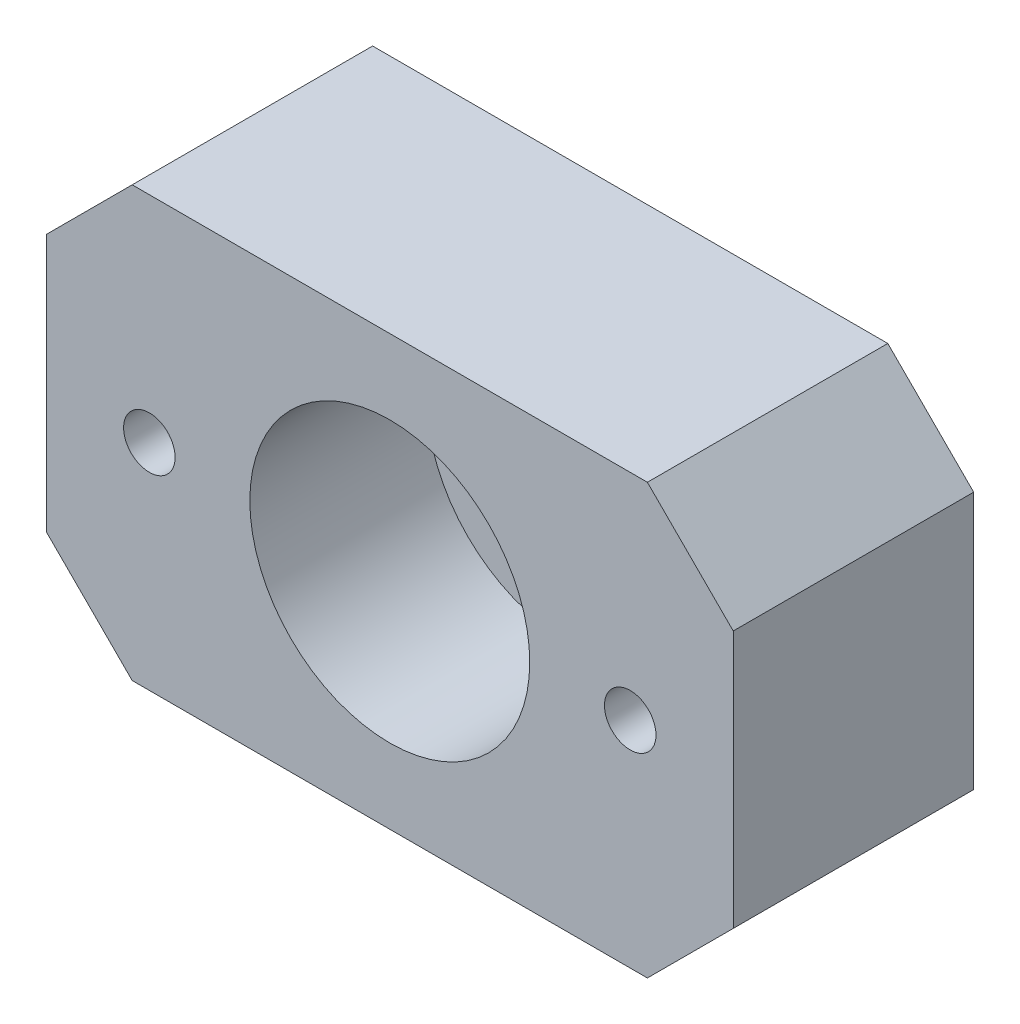
ISO-10303-21;
HEADER;
FILE_DESCRIPTION(('STEP AP214'),'2;1');
FILE_NAME('part.step','',(''),(''),'','','');
FILE_SCHEMA(('AUTOMOTIVE_DESIGN { 1 0 10303 214 1 1 1 1 }'));
ENDSEC;
DATA;
#1=APPLICATION_CONTEXT('core data for automotive mechanical design processes');
#2=APPLICATION_PROTOCOL_DEFINITION('international standard','automotive_design',2000,#1);
#3=PRODUCT_CONTEXT('',#1,'mechanical');
#4=PRODUCT('Part','Part','',(#3));
#5=PRODUCT_RELATED_PRODUCT_CATEGORY('part','',(#4));
#6=PRODUCT_DEFINITION_FORMATION('','',#4);
#7=PRODUCT_DEFINITION_CONTEXT('part definition',#1,'design');
#8=PRODUCT_DEFINITION('design','',#6,#7);
#9=PRODUCT_DEFINITION_SHAPE('','',#8);
#10=(LENGTH_UNIT() NAMED_UNIT(*) SI_UNIT(.MILLI.,.METRE.));
#11=(NAMED_UNIT(*) PLANE_ANGLE_UNIT() SI_UNIT($,.RADIAN.));
#12=(NAMED_UNIT(*) SI_UNIT($,.STERADIAN.) SOLID_ANGLE_UNIT());
#13=UNCERTAINTY_MEASURE_WITH_UNIT(LENGTH_MEASURE(1.E-05),#10,'distance_accuracy_value','');
#14=(GEOMETRIC_REPRESENTATION_CONTEXT(3) GLOBAL_UNCERTAINTY_ASSIGNED_CONTEXT((#13)) GLOBAL_UNIT_ASSIGNED_CONTEXT((#10,
#11,#12)) REPRESENTATION_CONTEXT('',''));
#15=CARTESIAN_POINT('',(0.,0.,0.));
#16=DIRECTION('',(0.,0.,1.));
#17=DIRECTION('',(1.,0.,0.));
#18=AXIS2_PLACEMENT_3D('',#15,#16,#17);
#19=CARTESIAN_POINT('',(0.,0.,14.));
#20=DIRECTION('',(1.,0.,0.));
#21=DIRECTION('',(0.,1.,0.));
#22=AXIS2_PLACEMENT_3D('',#19,#20,#21);
#23=PLANE('',#22);
#24=DIRECTION('',(0.,-1.,0.));
#25=VECTOR('',#24,1.);
#26=CARTESIAN_POINT('',(0.,0.,0.));
#27=LINE('',#26,#25);
#28=CARTESIAN_POINT('',(0.,20.,0.));
#29=VERTEX_POINT('',#28);
#30=CARTESIAN_POINT('',(0.,5.00000000000002,0.));
#31=VERTEX_POINT('',#30);
#32=EDGE_CURVE('E135',#29,#31,#27,.T.);
#33=ORIENTED_EDGE('',*,*,#32,.T.);
#34=DIRECTION('',(0.,0.,1.));
#35=VECTOR('',#34,1.);
#36=CARTESIAN_POINT('',(0.,5.00000000000002,14.));
#37=LINE('',#36,#35);
#38=CARTESIAN_POINT('',(0.,5.00000000000002,14.));
#39=VERTEX_POINT('',#38);
#40=EDGE_CURVE('E158',#31,#39,#37,.T.);
#41=ORIENTED_EDGE('',*,*,#40,.T.);
#42=DIRECTION('',(0.,-1.,0.));
#43=VECTOR('',#42,1.);
#44=CARTESIAN_POINT('',(0.,0.,14.));
#45=LINE('',#44,#43);
#46=CARTESIAN_POINT('',(0.,20.,14.));
#47=VERTEX_POINT('',#46);
#48=EDGE_CURVE('E133',#47,#39,#45,.T.);
#49=ORIENTED_EDGE('',*,*,#48,.F.);
#50=DIRECTION('',(0.,0.,-1.));
#51=VECTOR('',#50,1.);
#52=CARTESIAN_POINT('',(0.,20.,14.));
#53=LINE('',#52,#51);
#54=EDGE_CURVE('E155',#47,#29,#53,.T.);
#55=ORIENTED_EDGE('',*,*,#54,.T.);
#56=EDGE_LOOP('',(#33,#41,#49,#55));
#57=FACE_BOUND('',#56,.T.);
#58=ADVANCED_FACE('F39',(#57),#23,.F.);
#59=CARTESIAN_POINT('',(0.,0.,14.));
#60=DIRECTION('',(0.,1.,0.));
#61=DIRECTION('',(0.,0.,1.));
#62=AXIS2_PLACEMENT_3D('',#59,#60,#61);
#63=PLANE('',#62);
#64=DIRECTION('',(1.,0.,0.));
#65=VECTOR('',#64,1.);
#66=CARTESIAN_POINT('',(0.,0.,0.));
#67=LINE('',#66,#65);
#68=CARTESIAN_POINT('',(5.,0.,0.));
#69=VERTEX_POINT('',#68);
#70=CARTESIAN_POINT('',(35.,0.,0.));
#71=VERTEX_POINT('',#70);
#72=EDGE_CURVE('E131',#69,#71,#67,.T.);
#73=ORIENTED_EDGE('',*,*,#72,.T.);
#74=DIRECTION('',(0.,0.,1.));
#75=VECTOR('',#74,1.);
#76=CARTESIAN_POINT('',(35.,0.,14.));
#77=LINE('',#76,#75);
#78=CARTESIAN_POINT('',(35.,0.,14.));
#79=VERTEX_POINT('',#78);
#80=EDGE_CURVE('E110',#71,#79,#77,.T.);
#81=ORIENTED_EDGE('',*,*,#80,.T.);
#82=DIRECTION('',(1.,0.,0.));
#83=VECTOR('',#82,1.);
#84=CARTESIAN_POINT('',(0.,0.,14.));
#85=LINE('',#84,#83);
#86=CARTESIAN_POINT('',(5.,0.,14.));
#87=VERTEX_POINT('',#86);
#88=EDGE_CURVE('E174',#87,#79,#85,.T.);
#89=ORIENTED_EDGE('',*,*,#88,.F.);
#90=DIRECTION('',(0.,0.,-1.));
#91=VECTOR('',#90,1.);
#92=CARTESIAN_POINT('',(5.,0.,14.));
#93=LINE('',#92,#91);
#94=EDGE_CURVE('E115',#87,#69,#93,.T.);
#95=ORIENTED_EDGE('',*,*,#94,.T.);
#96=EDGE_LOOP('',(#73,#81,#89,#95));
#97=FACE_BOUND('',#96,.T.);
#98=ADVANCED_FACE('F220',(#97),#63,.F.);
#99=CARTESIAN_POINT('',(40.,0.,14.));
#100=DIRECTION('',(-1.,0.,0.));
#101=DIRECTION('',(0.,-1.,0.));
#102=AXIS2_PLACEMENT_3D('',#99,#100,#101);
#103=PLANE('',#102);
#104=DIRECTION('',(0.,1.,0.));
#105=VECTOR('',#104,1.);
#106=CARTESIAN_POINT('',(40.,0.,14.));
#107=LINE('',#106,#105);
#108=CARTESIAN_POINT('',(40.,4.99999999999999,14.));
#109=VERTEX_POINT('',#108);
#110=CARTESIAN_POINT('',(40.,20.,14.));
#111=VERTEX_POINT('',#110);
#112=EDGE_CURVE('E124',#109,#111,#107,.T.);
#113=ORIENTED_EDGE('',*,*,#112,.F.);
#114=DIRECTION('',(0.,0.,-1.));
#115=VECTOR('',#114,1.);
#116=CARTESIAN_POINT('',(40.,4.99999999999999,14.));
#117=LINE('',#116,#115);
#118=CARTESIAN_POINT('',(40.,4.99999999999999,0.));
#119=VERTEX_POINT('',#118);
#120=EDGE_CURVE('E109',#109,#119,#117,.T.);
#121=ORIENTED_EDGE('',*,*,#120,.T.);
#122=DIRECTION('',(0.,1.,0.));
#123=VECTOR('',#122,1.);
#124=CARTESIAN_POINT('',(40.,0.,0.));
#125=LINE('',#124,#123);
#126=CARTESIAN_POINT('',(40.,20.,0.));
#127=VERTEX_POINT('',#126);
#128=EDGE_CURVE('E122',#119,#127,#125,.T.);
#129=ORIENTED_EDGE('',*,*,#128,.T.);
#130=DIRECTION('',(0.,0.,1.));
#131=VECTOR('',#130,1.);
#132=CARTESIAN_POINT('',(40.,20.,14.));
#133=LINE('',#132,#131);
#134=EDGE_CURVE('E126',#127,#111,#133,.T.);
#135=ORIENTED_EDGE('',*,*,#134,.T.);
#136=EDGE_LOOP('',(#113,#121,#129,#135));
#137=FACE_BOUND('',#136,.T.);
#138=ADVANCED_FACE('F121',(#137),#103,.F.);
#139=CARTESIAN_POINT('',(0.,25.,14.));
#140=DIRECTION('',(0.,-1.,0.));
#141=DIRECTION('',(0.,0.,-1.));
#142=AXIS2_PLACEMENT_3D('',#139,#140,#141);
#143=PLANE('',#142);
#144=DIRECTION('',(-1.,0.,0.));
#145=VECTOR('',#144,1.);
#146=CARTESIAN_POINT('',(0.,25.,0.));
#147=LINE('',#146,#145);
#148=CARTESIAN_POINT('',(35.,25.,0.));
#149=VERTEX_POINT('',#148);
#150=CARTESIAN_POINT('',(5.,25.,0.));
#151=VERTEX_POINT('',#150);
#152=EDGE_CURVE('E130',#149,#151,#147,.T.);
#153=ORIENTED_EDGE('',*,*,#152,.T.);
#154=DIRECTION('',(0.,0.,1.));
#155=VECTOR('',#154,1.);
#156=CARTESIAN_POINT('',(5.,25.,14.));
#157=LINE('',#156,#155);
#158=CARTESIAN_POINT('',(5.,25.,14.));
#159=VERTEX_POINT('',#158);
#160=EDGE_CURVE('E11',#151,#159,#157,.T.);
#161=ORIENTED_EDGE('',*,*,#160,.T.);
#162=DIRECTION('',(-1.,0.,0.));
#163=VECTOR('',#162,1.);
#164=CARTESIAN_POINT('',(0.,25.,14.));
#165=LINE('',#164,#163);
#166=CARTESIAN_POINT('',(35.,25.,14.));
#167=VERTEX_POINT('',#166);
#168=EDGE_CURVE('E139',#167,#159,#165,.T.);
#169=ORIENTED_EDGE('',*,*,#168,.F.);
#170=DIRECTION('',(0.,0.,-1.));
#171=VECTOR('',#170,1.);
#172=CARTESIAN_POINT('',(35.,25.,14.));
#173=LINE('',#172,#171);
#174=EDGE_CURVE('E48',#167,#149,#173,.T.);
#175=ORIENTED_EDGE('',*,*,#174,.T.);
#176=EDGE_LOOP('',(#153,#161,#169,#175));
#177=FACE_BOUND('',#176,.T.);
#178=ADVANCED_FACE('F161',(#177),#143,.F.);
#179=CARTESIAN_POINT('',(0.,0.,14.));
#180=DIRECTION('',(0.,0.,-1.));
#181=DIRECTION('',(-1.,0.,0.));
#182=AXIS2_PLACEMENT_3D('',#179,#180,#181);
#183=PLANE('',#182);
#184=CARTESIAN_POINT('',(5.99999999999999,12.5,14.));
#185=DIRECTION('',(0.,0.,1.));
#186=DIRECTION('',(1.,0.,0.));
#187=AXIS2_PLACEMENT_3D('',#184,#185,#186);
#188=CIRCLE('',#187,1.5);
#189=CARTESIAN_POINT('',(7.49999999999999,12.5,14.));
#190=VERTEX_POINT('',#189);
#191=EDGE_CURVE('E193',#190,#190,#188,.T.);
#192=ORIENTED_EDGE('',*,*,#191,.F.);
#193=EDGE_LOOP('',(#192));
#194=FACE_BOUND('',#193,.T.);
#195=CARTESIAN_POINT('',(34.,12.5,14.));
#196=DIRECTION('',(0.,0.,1.));
#197=DIRECTION('',(1.,0.,0.));
#198=AXIS2_PLACEMENT_3D('',#195,#196,#197);
#199=CIRCLE('',#198,1.5);
#200=CARTESIAN_POINT('',(35.5,12.5,14.));
#201=VERTEX_POINT('',#200);
#202=EDGE_CURVE('E199',#201,#201,#199,.T.);
#203=ORIENTED_EDGE('',*,*,#202,.F.);
#204=EDGE_LOOP('',(#203));
#205=FACE_BOUND('',#204,.T.);
#206=CARTESIAN_POINT('',(20.,12.5,14.));
#207=DIRECTION('',(0.,0.,1.));
#208=DIRECTION('',(1.,0.,0.));
#209=AXIS2_PLACEMENT_3D('',#206,#207,#208);
#210=CIRCLE('',#209,8.15);
#211=CARTESIAN_POINT('',(28.15,12.5,14.));
#212=VERTEX_POINT('',#211);
#213=EDGE_CURVE('E179',#212,#212,#210,.T.);
#214=ORIENTED_EDGE('',*,*,#213,.F.);
#215=EDGE_LOOP('',(#214));
#216=FACE_BOUND('',#215,.T.);
#217=ORIENTED_EDGE('',*,*,#88,.T.);
#218=DIRECTION('',(-0.707106781186549,-0.707106781186546,0.));
#219=VECTOR('',#218,1.);
#220=CARTESIAN_POINT('',(40.,4.99999999999999,14.));
#221=LINE('',#220,#219);
#222=EDGE_CURVE('E153',#79,#109,#221,.F.);
#223=ORIENTED_EDGE('',*,*,#222,.T.);
#224=ORIENTED_EDGE('',*,*,#112,.T.);
#225=DIRECTION('',(0.707106781186547,-0.707106781186549,0.));
#226=VECTOR('',#225,1.);
#227=CARTESIAN_POINT('',(35.,25.,14.));
#228=LINE('',#227,#226);
#229=EDGE_CURVE('E60',#111,#167,#228,.F.);
#230=ORIENTED_EDGE('',*,*,#229,.T.);
#231=ORIENTED_EDGE('',*,*,#168,.T.);
#232=DIRECTION('',(0.707106781186549,0.707106781186546,0.));
#233=VECTOR('',#232,1.);
#234=CARTESIAN_POINT('',(0.,20.,14.));
#235=LINE('',#234,#233);
#236=EDGE_CURVE('E149',#159,#47,#235,.F.);
#237=ORIENTED_EDGE('',*,*,#236,.T.);
#238=ORIENTED_EDGE('',*,*,#48,.T.);
#239=DIRECTION('',(-0.707106781186547,0.707106781186549,0.));
#240=VECTOR('',#239,1.);
#241=CARTESIAN_POINT('',(5.,0.,14.));
#242=LINE('',#241,#240);
#243=EDGE_CURVE('E151',#39,#87,#242,.F.);
#244=ORIENTED_EDGE('',*,*,#243,.T.);
#245=EDGE_LOOP('',(#217,#223,#224,#230,#231,#237,#238,#244));
#246=FACE_BOUND('',#245,.T.);
#247=ADVANCED_FACE('F210',(#194,#205,#216,#246),#183,.F.);
#248=CARTESIAN_POINT('',(0.,0.,0.));
#249=DIRECTION('',(0.,0.,-1.));
#250=DIRECTION('',(-1.,0.,0.));
#251=AXIS2_PLACEMENT_3D('',#248,#249,#250);
#252=PLANE('',#251);
#253=CARTESIAN_POINT('',(5.99999999999999,12.5,0.));
#254=DIRECTION('',(0.,0.,-1.));
#255=DIRECTION('',(-1.,0.,0.));
#256=AXIS2_PLACEMENT_3D('',#253,#254,#255);
#257=CIRCLE('',#256,1.5);
#258=CARTESIAN_POINT('',(7.49999999999999,12.5,0.));
#259=VERTEX_POINT('',#258);
#260=EDGE_CURVE('E202',#259,#259,#257,.F.);
#261=ORIENTED_EDGE('',*,*,#260,.T.);
#262=EDGE_LOOP('',(#261));
#263=FACE_BOUND('',#262,.T.);
#264=CARTESIAN_POINT('',(34.,12.5,0.));
#265=DIRECTION('',(0.,0.,-1.));
#266=DIRECTION('',(-1.,0.,0.));
#267=AXIS2_PLACEMENT_3D('',#264,#265,#266);
#268=CIRCLE('',#267,1.5);
#269=CARTESIAN_POINT('',(35.5,12.5,0.));
#270=VERTEX_POINT('',#269);
#271=EDGE_CURVE('E196',#270,#270,#268,.F.);
#272=ORIENTED_EDGE('',*,*,#271,.T.);
#273=EDGE_LOOP('',(#272));
#274=FACE_BOUND('',#273,.T.);
#275=CARTESIAN_POINT('',(20.,12.5,0.));
#276=DIRECTION('',(0.,0.,-1.));
#277=DIRECTION('',(-1.,0.,0.));
#278=AXIS2_PLACEMENT_3D('',#275,#276,#277);
#279=CIRCLE('',#278,2.65);
#280=CARTESIAN_POINT('',(17.35,12.5,0.));
#281=VERTEX_POINT('',#280);
#282=EDGE_CURVE('E190',#281,#281,#279,.F.);
#283=ORIENTED_EDGE('',*,*,#282,.T.);
#284=EDGE_LOOP('',(#283));
#285=FACE_BOUND('',#284,.T.);
#286=ORIENTED_EDGE('',*,*,#128,.F.);
#287=DIRECTION('',(0.707106781186549,0.707106781186546,0.));
#288=VECTOR('',#287,1.);
#289=CARTESIAN_POINT('',(17.4999999999999,-17.5,0.));
#290=LINE('',#289,#288);
#291=EDGE_CURVE('E105',#119,#71,#290,.F.);
#292=ORIENTED_EDGE('',*,*,#291,.T.);
#293=ORIENTED_EDGE('',*,*,#72,.F.);
#294=DIRECTION('',(0.707106781186547,-0.707106781186549,0.));
#295=VECTOR('',#294,1.);
#296=CARTESIAN_POINT('',(2.50000000000001,2.5,0.));
#297=LINE('',#296,#295);
#298=EDGE_CURVE('E116',#69,#31,#297,.F.);
#299=ORIENTED_EDGE('',*,*,#298,.T.);
#300=ORIENTED_EDGE('',*,*,#32,.F.);
#301=DIRECTION('',(-0.707106781186549,-0.707106781186546,0.));
#302=VECTOR('',#301,1.);
#303=CARTESIAN_POINT('',(-10.,10.0000000000001,0.));
#304=LINE('',#303,#302);
#305=EDGE_CURVE('E142',#29,#151,#304,.F.);
#306=ORIENTED_EDGE('',*,*,#305,.T.);
#307=ORIENTED_EDGE('',*,*,#152,.F.);
#308=DIRECTION('',(-0.707106781186547,0.707106781186549,0.));
#309=VECTOR('',#308,1.);
#310=CARTESIAN_POINT('',(30.,30.,0.));
#311=LINE('',#310,#309);
#312=EDGE_CURVE('E125',#149,#127,#311,.F.);
#313=ORIENTED_EDGE('',*,*,#312,.T.);
#314=EDGE_LOOP('',(#286,#292,#293,#299,#300,#306,#307,#313));
#315=FACE_BOUND('',#314,.T.);
#316=ADVANCED_FACE('F128',(#263,#274,#285,#315),#252,.T.);
#317=CARTESIAN_POINT('',(20.,12.5,3.7));
#318=DIRECTION('',(0.,0.,1.));
#319=DIRECTION('',(1.,0.,0.));
#320=AXIS2_PLACEMENT_3D('',#317,#318,#319);
#321=CYLINDRICAL_SURFACE('',#320,8.15);
#322=CARTESIAN_POINT('',(20.,12.5,3.7));
#323=DIRECTION('',(0.,0.,1.));
#324=DIRECTION('',(1.,0.,0.));
#325=AXIS2_PLACEMENT_3D('',#322,#323,#324);
#326=CIRCLE('',#325,8.15);
#327=CARTESIAN_POINT('',(28.15,12.5,3.7));
#328=VERTEX_POINT('',#327);
#329=EDGE_CURVE('E183',#328,#328,#326,.T.);
#330=CARTESIAN_POINT('',(28.15,12.5,3.7));
#331=CARTESIAN_POINT('',(28.15,12.5,3.80729166666667));
#332=CARTESIAN_POINT('',(28.15,12.5,3.91458333333333));
#333=CARTESIAN_POINT('',(28.15,12.5,4.12916666666667));
#334=CARTESIAN_POINT('',(28.15,12.5,4.23645833333333));
#335=CARTESIAN_POINT('',(28.15,12.5,4.45104166666667));
#336=CARTESIAN_POINT('',(28.15,12.5,4.55833333333333));
#337=CARTESIAN_POINT('',(28.15,12.5,4.77291666666667));
#338=CARTESIAN_POINT('',(28.15,12.5,4.88020833333333));
#339=CARTESIAN_POINT('',(28.15,12.5,5.09479166666667));
#340=CARTESIAN_POINT('',(28.15,12.5,5.20208333333333));
#341=CARTESIAN_POINT('',(28.15,12.5,5.41666666666667));
#342=CARTESIAN_POINT('',(28.15,12.5,5.52395833333333));
#343=CARTESIAN_POINT('',(28.15,12.5,5.73854166666667));
#344=CARTESIAN_POINT('',(28.15,12.5,5.84583333333333));
#345=CARTESIAN_POINT('',(28.15,12.5,6.06041666666667));
#346=CARTESIAN_POINT('',(28.15,12.5,6.16770833333333));
#347=CARTESIAN_POINT('',(28.15,12.5,6.38229166666667));
#348=CARTESIAN_POINT('',(28.15,12.5,6.48958333333333));
#349=CARTESIAN_POINT('',(28.15,12.5,6.70416666666667));
#350=CARTESIAN_POINT('',(28.15,12.5,6.81145833333333));
#351=CARTESIAN_POINT('',(28.15,12.5,7.02604166666667));
#352=CARTESIAN_POINT('',(28.15,12.5,7.13333333333333));
#353=CARTESIAN_POINT('',(28.15,12.5,7.34791666666667));
#354=CARTESIAN_POINT('',(28.15,12.5,7.45520833333333));
#355=CARTESIAN_POINT('',(28.15,12.5,7.66979166666667));
#356=CARTESIAN_POINT('',(28.15,12.5,7.77708333333333));
#357=CARTESIAN_POINT('',(28.15,12.5,7.99166666666667));
#358=CARTESIAN_POINT('',(28.15,12.5,8.09895833333333));
#359=CARTESIAN_POINT('',(28.15,12.5,8.31354166666667));
#360=CARTESIAN_POINT('',(28.15,12.5,8.42083333333333));
#361=CARTESIAN_POINT('',(28.15,12.5,8.63541666666667));
#362=CARTESIAN_POINT('',(28.15,12.5,8.74270833333333));
#363=CARTESIAN_POINT('',(28.15,12.5,8.95729166666667));
#364=CARTESIAN_POINT('',(28.15,12.5,9.06458333333333));
#365=CARTESIAN_POINT('',(28.15,12.5,9.27916666666667));
#366=CARTESIAN_POINT('',(28.15,12.5,9.38645833333333));
#367=CARTESIAN_POINT('',(28.15,12.5,9.60104166666667));
#368=CARTESIAN_POINT('',(28.15,12.5,9.70833333333333));
#369=CARTESIAN_POINT('',(28.15,12.5,9.92291666666667));
#370=CARTESIAN_POINT('',(28.15,12.5,10.0302083333333));
#371=CARTESIAN_POINT('',(28.15,12.5,10.2447916666667));
#372=CARTESIAN_POINT('',(28.15,12.5,10.3520833333333));
#373=CARTESIAN_POINT('',(28.15,12.5,10.5666666666667));
#374=CARTESIAN_POINT('',(28.15,12.5,10.6739583333333));
#375=CARTESIAN_POINT('',(28.15,12.5,10.8885416666667));
#376=CARTESIAN_POINT('',(28.15,12.5,10.9958333333333));
#377=CARTESIAN_POINT('',(28.15,12.5,11.2104166666667));
#378=CARTESIAN_POINT('',(28.15,12.5,11.3177083333333));
#379=CARTESIAN_POINT('',(28.15,12.5,11.5322916666667));
#380=CARTESIAN_POINT('',(28.15,12.5,11.6395833333333));
#381=CARTESIAN_POINT('',(28.15,12.5,11.8541666666667));
#382=CARTESIAN_POINT('',(28.15,12.5,11.9614583333333));
#383=CARTESIAN_POINT('',(28.15,12.5,12.1760416666667));
#384=CARTESIAN_POINT('',(28.15,12.5,12.2833333333333));
#385=CARTESIAN_POINT('',(28.15,12.5,12.4979166666667));
#386=CARTESIAN_POINT('',(28.15,12.5,12.6052083333333));
#387=CARTESIAN_POINT('',(28.15,12.5,12.8197916666667));
#388=CARTESIAN_POINT('',(28.15,12.5,12.9270833333333));
#389=CARTESIAN_POINT('',(28.15,12.5,13.1416666666667));
#390=CARTESIAN_POINT('',(28.15,12.5,13.2489583333333));
#391=CARTESIAN_POINT('',(28.15,12.5,13.4635416666667));
#392=CARTESIAN_POINT('',(28.15,12.5,13.5708333333333));
#393=CARTESIAN_POINT('',(28.15,12.5,13.7854166666667));
#394=CARTESIAN_POINT('',(28.15,12.5,13.8927083333333));
#395=CARTESIAN_POINT('',(28.15,12.5,14.));
#396=B_SPLINE_CURVE_WITH_KNOTS('',3,(#330,#331,#332,#333,#334,#335,#336,#337,#338,#339,#340,
#341,#342,#343,#344,#345,#346,#347,#348,#349,#350,#351,#352,#353,#354,#355,#356,#357,#358,#359,
#360,#361,#362,#363,#364,#365,#366,#367,#368,#369,#370,#371,#372,#373,#374,#375,#376,#377,#378,
#379,#380,#381,#382,#383,#384,#385,#386,#387,#388,#389,#390,#391,#392,#393,#394,#395),
.UNSPECIFIED.,.F.,.F.,(4,2,2,2,2,2,2,2,2,2,2,2,2,2,2,2,2,2,2,2,2,2,2,2,2,2,2,2,2,2,2,2,4),(0.,
0.321875000000001,0.64375,0.965625,1.2875,1.609375,1.93125,2.253125,2.575,2.896875,3.21875,
3.540625,3.8625,4.184375,4.50625,4.828125,5.15,5.471875,5.79375,6.115625,6.4375,6.759375,
7.08125,7.403125,7.725,8.046875,8.36875,8.690625,9.0125,9.334375,9.65625,9.978125,10.3),.UNSPECIFIED.);
#397=EDGE_CURVE('BSEAM253',#328,#212,#396,.T.);
#398=ORIENTED_EDGE('',*,*,#329,.F.);
#399=ORIENTED_EDGE('',*,*,#213,.T.);
#400=ORIENTED_EDGE('',*,*,#397,.T.);
#401=ORIENTED_EDGE('',*,*,#397,.F.);
#402=EDGE_LOOP('',(#398,#400,#399,#401));
#403=FACE_BOUND('',#402,.T.);
#404=ADVANCED_FACE('F253',(#403),#321,.F.);
#405=CARTESIAN_POINT('',(20.,12.5,3.7));
#406=DIRECTION('',(0.,0.,1.));
#407=DIRECTION('',(1.,0.,0.));
#408=AXIS2_PLACEMENT_3D('',#405,#406,#407);
#409=PLANE('',#408);
#410=CARTESIAN_POINT('',(20.,12.5,3.7));
#411=DIRECTION('',(0.,0.,1.));
#412=DIRECTION('',(1.,0.,0.));
#413=AXIS2_PLACEMENT_3D('',#410,#411,#412);
#414=CIRCLE('',#413,2.65);
#415=CARTESIAN_POINT('',(22.65,12.5,3.7));
#416=VERTEX_POINT('',#415);
#417=EDGE_CURVE('E188',#416,#416,#414,.T.);
#418=ORIENTED_EDGE('',*,*,#417,.F.);
#419=EDGE_LOOP('',(#418));
#420=FACE_BOUND('',#419,.T.);
#421=ORIENTED_EDGE('',*,*,#329,.T.);
#422=EDGE_LOOP('',(#421));
#423=FACE_BOUND('',#422,.T.);
#424=ADVANCED_FACE('F258',(#420,#423),#409,.T.);
#425=CARTESIAN_POINT('',(20.,12.5,-0.00100000000000013));
#426=DIRECTION('',(0.,0.,1.));
#427=DIRECTION('',(1.,0.,0.));
#428=AXIS2_PLACEMENT_3D('',#425,#426,#427);
#429=CYLINDRICAL_SURFACE('',#428,2.65);
#430=ORIENTED_EDGE('',*,*,#282,.F.);
#431=EDGE_LOOP('',(#430));
#432=FACE_BOUND('',#431,.T.);
#433=ORIENTED_EDGE('',*,*,#417,.T.);
#434=EDGE_LOOP('',(#433));
#435=FACE_BOUND('',#434,.T.);
#436=ADVANCED_FACE('F262',(#432,#435),#429,.F.);
#437=CARTESIAN_POINT('',(34.,12.5,-0.000999999999999265));
#438=DIRECTION('',(0.,0.,1.));
#439=DIRECTION('',(1.,0.,0.));
#440=AXIS2_PLACEMENT_3D('',#437,#438,#439);
#441=CYLINDRICAL_SURFACE('',#440,1.5);
#442=CARTESIAN_POINT('',(35.5,12.5,0.));
#443=CARTESIAN_POINT('',(35.5,12.5,0.145833333333333));
#444=CARTESIAN_POINT('',(35.5,12.5,0.291666666666667));
#445=CARTESIAN_POINT('',(35.5,12.5,0.583333333333333));
#446=CARTESIAN_POINT('',(35.5,12.5,0.729166666666667));
#447=CARTESIAN_POINT('',(35.5,12.5,1.02083333333333));
#448=CARTESIAN_POINT('',(35.5,12.5,1.16666666666667));
#449=CARTESIAN_POINT('',(35.5,12.5,1.45833333333333));
#450=CARTESIAN_POINT('',(35.5,12.5,1.60416666666667));
#451=CARTESIAN_POINT('',(35.5,12.5,1.89583333333333));
#452=CARTESIAN_POINT('',(35.5,12.5,2.04166666666667));
#453=CARTESIAN_POINT('',(35.5,12.5,2.33333333333333));
#454=CARTESIAN_POINT('',(35.5,12.5,2.47916666666667));
#455=CARTESIAN_POINT('',(35.5,12.5,2.77083333333333));
#456=CARTESIAN_POINT('',(35.5,12.5,2.91666666666667));
#457=CARTESIAN_POINT('',(35.5,12.5,3.20833333333333));
#458=CARTESIAN_POINT('',(35.5,12.5,3.35416666666667));
#459=CARTESIAN_POINT('',(35.5,12.5,3.64583333333333));
#460=CARTESIAN_POINT('',(35.5,12.5,3.79166666666667));
#461=CARTESIAN_POINT('',(35.5,12.5,4.08333333333333));
#462=CARTESIAN_POINT('',(35.5,12.5,4.22916666666667));
#463=CARTESIAN_POINT('',(35.5,12.5,4.52083333333333));
#464=CARTESIAN_POINT('',(35.5,12.5,4.66666666666667));
#465=CARTESIAN_POINT('',(35.5,12.5,4.95833333333333));
#466=CARTESIAN_POINT('',(35.5,12.5,5.10416666666667));
#467=CARTESIAN_POINT('',(35.5,12.5,5.39583333333333));
#468=CARTESIAN_POINT('',(35.5,12.5,5.54166666666667));
#469=CARTESIAN_POINT('',(35.5,12.5,5.83333333333333));
#470=CARTESIAN_POINT('',(35.5,12.5,5.97916666666667));
#471=CARTESIAN_POINT('',(35.5,12.5,6.27083333333333));
#472=CARTESIAN_POINT('',(35.5,12.5,6.41666666666667));
#473=CARTESIAN_POINT('',(35.5,12.5,6.70833333333333));
#474=CARTESIAN_POINT('',(35.5,12.5,6.85416666666667));
#475=CARTESIAN_POINT('',(35.5,12.5,7.14583333333333));
#476=CARTESIAN_POINT('',(35.5,12.5,7.29166666666667));
#477=CARTESIAN_POINT('',(35.5,12.5,7.58333333333333));
#478=CARTESIAN_POINT('',(35.5,12.5,7.72916666666667));
#479=CARTESIAN_POINT('',(35.5,12.5,8.02083333333333));
#480=CARTESIAN_POINT('',(35.5,12.5,8.16666666666667));
#481=CARTESIAN_POINT('',(35.5,12.5,8.45833333333333));
#482=CARTESIAN_POINT('',(35.5,12.5,8.60416666666667));
#483=CARTESIAN_POINT('',(35.5,12.5,8.89583333333333));
#484=CARTESIAN_POINT('',(35.5,12.5,9.04166666666666));
#485=CARTESIAN_POINT('',(35.5,12.5,9.33333333333333));
#486=CARTESIAN_POINT('',(35.5,12.5,9.47916666666667));
#487=CARTESIAN_POINT('',(35.5,12.5,9.77083333333333));
#488=CARTESIAN_POINT('',(35.5,12.5,9.91666666666667));
#489=CARTESIAN_POINT('',(35.5,12.5,10.2083333333333));
#490=CARTESIAN_POINT('',(35.5,12.5,10.3541666666667));
#491=CARTESIAN_POINT('',(35.5,12.5,10.6458333333333));
#492=CARTESIAN_POINT('',(35.5,12.5,10.7916666666667));
#493=CARTESIAN_POINT('',(35.5,12.5,11.0833333333333));
#494=CARTESIAN_POINT('',(35.5,12.5,11.2291666666667));
#495=CARTESIAN_POINT('',(35.5,12.5,11.5208333333333));
#496=CARTESIAN_POINT('',(35.5,12.5,11.6666666666667));
#497=CARTESIAN_POINT('',(35.5,12.5,11.9583333333333));
#498=CARTESIAN_POINT('',(35.5,12.5,12.1041666666667));
#499=CARTESIAN_POINT('',(35.5,12.5,12.3958333333333));
#500=CARTESIAN_POINT('',(35.5,12.5,12.5416666666667));
#501=CARTESIAN_POINT('',(35.5,12.5,12.8333333333333));
#502=CARTESIAN_POINT('',(35.5,12.5,12.9791666666667));
#503=CARTESIAN_POINT('',(35.5,12.5,13.2708333333333));
#504=CARTESIAN_POINT('',(35.5,12.5,13.4166666666667));
#505=CARTESIAN_POINT('',(35.5,12.5,13.7083333333333));
#506=CARTESIAN_POINT('',(35.5,12.5,13.8541666666667));
#507=CARTESIAN_POINT('',(35.5,12.5,14.));
#508=B_SPLINE_CURVE_WITH_KNOTS('',3,(#442,#443,#444,#445,#446,#447,#448,#449,#450,#451,#452,
#453,#454,#455,#456,#457,#458,#459,#460,#461,#462,#463,#464,#465,#466,#467,#468,#469,#470,#471,
#472,#473,#474,#475,#476,#477,#478,#479,#480,#481,#482,#483,#484,#485,#486,#487,#488,#489,#490,
#491,#492,#493,#494,#495,#496,#497,#498,#499,#500,#501,#502,#503,#504,#505,#506,#507),
.UNSPECIFIED.,.F.,.F.,(4,2,2,2,2,2,2,2,2,2,2,2,2,2,2,2,2,2,2,2,2,2,2,2,2,2,2,2,2,2,2,2,4),(0.,
0.4375,0.875,1.3125,1.75,2.1875,2.625,3.0625,3.5,3.9375,4.375,4.8125,5.25,5.6875,6.125,6.5625,
7.,7.4375,7.875,8.3125,8.75,9.1875,9.625,10.0625,10.5,10.9375,11.375,11.8125,12.25,12.6875,
13.125,13.5625,14.),.UNSPECIFIED.);
#509=EDGE_CURVE('BSEAM266',#270,#201,#508,.T.);
#510=ORIENTED_EDGE('',*,*,#271,.F.);
#511=ORIENTED_EDGE('',*,*,#202,.T.);
#512=ORIENTED_EDGE('',*,*,#509,.T.);
#513=ORIENTED_EDGE('',*,*,#509,.F.);
#514=EDGE_LOOP('',(#510,#512,#511,#513));
#515=FACE_BOUND('',#514,.T.);
#516=ADVANCED_FACE('F266',(#515),#441,.F.);
#517=CARTESIAN_POINT('',(5.99999999999999,12.5,-0.000999999999999265));
#518=DIRECTION('',(0.,0.,1.));
#519=DIRECTION('',(1.,0.,0.));
#520=AXIS2_PLACEMENT_3D('',#517,#518,#519);
#521=CYLINDRICAL_SURFACE('',#520,1.5);
#522=CARTESIAN_POINT('',(7.49999999999999,12.5,0.));
#523=CARTESIAN_POINT('',(7.49999999999999,12.5,0.145833333333333));
#524=CARTESIAN_POINT('',(7.49999999999999,12.5,0.291666666666667));
#525=CARTESIAN_POINT('',(7.49999999999999,12.5,0.583333333333333));
#526=CARTESIAN_POINT('',(7.49999999999999,12.5,0.729166666666667));
#527=CARTESIAN_POINT('',(7.49999999999999,12.5,1.02083333333333));
#528=CARTESIAN_POINT('',(7.49999999999999,12.5,1.16666666666667));
#529=CARTESIAN_POINT('',(7.49999999999999,12.5,1.45833333333333));
#530=CARTESIAN_POINT('',(7.49999999999999,12.5,1.60416666666667));
#531=CARTESIAN_POINT('',(7.49999999999999,12.5,1.89583333333333));
#532=CARTESIAN_POINT('',(7.49999999999999,12.5,2.04166666666667));
#533=CARTESIAN_POINT('',(7.49999999999999,12.5,2.33333333333333));
#534=CARTESIAN_POINT('',(7.49999999999999,12.5,2.47916666666667));
#535=CARTESIAN_POINT('',(7.49999999999999,12.5,2.77083333333333));
#536=CARTESIAN_POINT('',(7.49999999999999,12.5,2.91666666666667));
#537=CARTESIAN_POINT('',(7.49999999999999,12.5,3.20833333333333));
#538=CARTESIAN_POINT('',(7.49999999999999,12.5,3.35416666666667));
#539=CARTESIAN_POINT('',(7.49999999999999,12.5,3.64583333333333));
#540=CARTESIAN_POINT('',(7.49999999999999,12.5,3.79166666666667));
#541=CARTESIAN_POINT('',(7.49999999999999,12.5,4.08333333333333));
#542=CARTESIAN_POINT('',(7.49999999999999,12.5,4.22916666666667));
#543=CARTESIAN_POINT('',(7.49999999999999,12.5,4.52083333333333));
#544=CARTESIAN_POINT('',(7.49999999999999,12.5,4.66666666666667));
#545=CARTESIAN_POINT('',(7.49999999999999,12.5,4.95833333333333));
#546=CARTESIAN_POINT('',(7.49999999999999,12.5,5.10416666666667));
#547=CARTESIAN_POINT('',(7.49999999999999,12.5,5.39583333333333));
#548=CARTESIAN_POINT('',(7.49999999999999,12.5,5.54166666666667));
#549=CARTESIAN_POINT('',(7.49999999999999,12.5,5.83333333333333));
#550=CARTESIAN_POINT('',(7.49999999999999,12.5,5.97916666666667));
#551=CARTESIAN_POINT('',(7.49999999999999,12.5,6.27083333333333));
#552=CARTESIAN_POINT('',(7.49999999999999,12.5,6.41666666666667));
#553=CARTESIAN_POINT('',(7.49999999999999,12.5,6.70833333333333));
#554=CARTESIAN_POINT('',(7.49999999999999,12.5,6.85416666666667));
#555=CARTESIAN_POINT('',(7.49999999999999,12.5,7.14583333333333));
#556=CARTESIAN_POINT('',(7.49999999999999,12.5,7.29166666666667));
#557=CARTESIAN_POINT('',(7.49999999999999,12.5,7.58333333333333));
#558=CARTESIAN_POINT('',(7.49999999999999,12.5,7.72916666666667));
#559=CARTESIAN_POINT('',(7.49999999999999,12.5,8.02083333333333));
#560=CARTESIAN_POINT('',(7.49999999999999,12.5,8.16666666666667));
#561=CARTESIAN_POINT('',(7.49999999999999,12.5,8.45833333333333));
#562=CARTESIAN_POINT('',(7.49999999999999,12.5,8.60416666666667));
#563=CARTESIAN_POINT('',(7.49999999999999,12.5,8.89583333333333));
#564=CARTESIAN_POINT('',(7.49999999999999,12.5,9.04166666666666));
#565=CARTESIAN_POINT('',(7.49999999999999,12.5,9.33333333333333));
#566=CARTESIAN_POINT('',(7.49999999999999,12.5,9.47916666666667));
#567=CARTESIAN_POINT('',(7.49999999999999,12.5,9.77083333333333));
#568=CARTESIAN_POINT('',(7.49999999999999,12.5,9.91666666666667));
#569=CARTESIAN_POINT('',(7.49999999999999,12.5,10.2083333333333));
#570=CARTESIAN_POINT('',(7.49999999999999,12.5,10.3541666666667));
#571=CARTESIAN_POINT('',(7.49999999999999,12.5,10.6458333333333));
#572=CARTESIAN_POINT('',(7.49999999999999,12.5,10.7916666666667));
#573=CARTESIAN_POINT('',(7.49999999999999,12.5,11.0833333333333));
#574=CARTESIAN_POINT('',(7.49999999999999,12.5,11.2291666666667));
#575=CARTESIAN_POINT('',(7.49999999999999,12.5,11.5208333333333));
#576=CARTESIAN_POINT('',(7.49999999999999,12.5,11.6666666666667));
#577=CARTESIAN_POINT('',(7.49999999999999,12.5,11.9583333333333));
#578=CARTESIAN_POINT('',(7.49999999999999,12.5,12.1041666666667));
#579=CARTESIAN_POINT('',(7.49999999999999,12.5,12.3958333333333));
#580=CARTESIAN_POINT('',(7.49999999999999,12.5,12.5416666666667));
#581=CARTESIAN_POINT('',(7.49999999999999,12.5,12.8333333333333));
#582=CARTESIAN_POINT('',(7.49999999999999,12.5,12.9791666666667));
#583=CARTESIAN_POINT('',(7.49999999999999,12.5,13.2708333333333));
#584=CARTESIAN_POINT('',(7.49999999999999,12.5,13.4166666666667));
#585=CARTESIAN_POINT('',(7.49999999999999,12.5,13.7083333333333));
#586=CARTESIAN_POINT('',(7.49999999999999,12.5,13.8541666666667));
#587=CARTESIAN_POINT('',(7.49999999999999,12.5,14.));
#588=B_SPLINE_CURVE_WITH_KNOTS('',3,(#522,#523,#524,#525,#526,#527,#528,#529,#530,#531,#532,
#533,#534,#535,#536,#537,#538,#539,#540,#541,#542,#543,#544,#545,#546,#547,#548,#549,#550,#551,
#552,#553,#554,#555,#556,#557,#558,#559,#560,#561,#562,#563,#564,#565,#566,#567,#568,#569,#570,
#571,#572,#573,#574,#575,#576,#577,#578,#579,#580,#581,#582,#583,#584,#585,#586,#587),
.UNSPECIFIED.,.F.,.F.,(4,2,2,2,2,2,2,2,2,2,2,2,2,2,2,2,2,2,2,2,2,2,2,2,2,2,2,2,2,2,2,2,4),(0.,
0.4375,0.875,1.3125,1.75,2.1875,2.625,3.0625,3.5,3.9375,4.375,4.8125,5.25,5.6875,6.125,6.5625,
7.,7.4375,7.875,8.3125,8.75,9.1875,9.625,10.0625,10.5,10.9375,11.375,11.8125,12.25,12.6875,
13.125,13.5625,14.),.UNSPECIFIED.);
#589=EDGE_CURVE('BSEAM208',#259,#190,#588,.T.);
#590=ORIENTED_EDGE('',*,*,#260,.F.);
#591=ORIENTED_EDGE('',*,*,#191,.T.);
#592=ORIENTED_EDGE('',*,*,#589,.T.);
#593=ORIENTED_EDGE('',*,*,#589,.F.);
#594=EDGE_LOOP('',(#590,#592,#591,#593));
#595=FACE_BOUND('',#594,.T.);
#596=ADVANCED_FACE('F208',(#595),#521,.F.);
#597=CARTESIAN_POINT('',(40.,4.99999999999999,14.));
#598=DIRECTION('',(-0.707106781186546,0.707106781186549,0.));
#599=DIRECTION('',(0.,0.,-1.));
#600=AXIS2_PLACEMENT_3D('',#597,#598,#599);
#601=PLANE('',#600);
#602=ORIENTED_EDGE('',*,*,#222,.F.);
#603=ORIENTED_EDGE('',*,*,#80,.F.);
#604=ORIENTED_EDGE('',*,*,#291,.F.);
#605=ORIENTED_EDGE('',*,*,#120,.F.);
#606=EDGE_LOOP('',(#602,#603,#604,#605));
#607=FACE_BOUND('',#606,.T.);
#608=ADVANCED_FACE('F108',(#607),#601,.F.);
#609=CARTESIAN_POINT('',(5.,0.,14.));
#610=DIRECTION('',(0.707106781186549,0.707106781186547,0.));
#611=DIRECTION('',(0.,0.,-1.));
#612=AXIS2_PLACEMENT_3D('',#609,#610,#611);
#613=PLANE('',#612);
#614=ORIENTED_EDGE('',*,*,#243,.F.);
#615=ORIENTED_EDGE('',*,*,#40,.F.);
#616=ORIENTED_EDGE('',*,*,#298,.F.);
#617=ORIENTED_EDGE('',*,*,#94,.F.);
#618=EDGE_LOOP('',(#614,#615,#616,#617));
#619=FACE_BOUND('',#618,.T.);
#620=ADVANCED_FACE('F222',(#619),#613,.F.);
#621=CARTESIAN_POINT('',(0.,20.,14.));
#622=DIRECTION('',(0.707106781186546,-0.707106781186549,0.));
#623=DIRECTION('',(0.,0.,-1.));
#624=AXIS2_PLACEMENT_3D('',#621,#622,#623);
#625=PLANE('',#624);
#626=ORIENTED_EDGE('',*,*,#236,.F.);
#627=ORIENTED_EDGE('',*,*,#160,.F.);
#628=ORIENTED_EDGE('',*,*,#305,.F.);
#629=ORIENTED_EDGE('',*,*,#54,.F.);
#630=EDGE_LOOP('',(#626,#627,#628,#629));
#631=FACE_BOUND('',#630,.T.);
#632=ADVANCED_FACE('F168',(#631),#625,.F.);
#633=CARTESIAN_POINT('',(35.,25.,14.));
#634=DIRECTION('',(-0.707106781186548,-0.707106781186546,0.));
#635=DIRECTION('',(0.,0.,-1.));
#636=AXIS2_PLACEMENT_3D('',#633,#634,#635);
#637=PLANE('',#636);
#638=ORIENTED_EDGE('',*,*,#229,.F.);
#639=ORIENTED_EDGE('',*,*,#134,.F.);
#640=ORIENTED_EDGE('',*,*,#312,.F.);
#641=ORIENTED_EDGE('',*,*,#174,.F.);
#642=EDGE_LOOP('',(#638,#639,#640,#641));
#643=FACE_BOUND('',#642,.T.);
#644=ADVANCED_FACE('F42',(#643),#637,.F.);
#645=CLOSED_SHELL('',(#58,#98,#138,#178,#247,#316,#404,#424,#436,#516,#596,#608,#620,#632,#644));
#646=MANIFOLD_SOLID_BREP('B2',#645);
#647=ADVANCED_BREP_SHAPE_REPRESENTATION('',(#18,#646),#14);
#648=SHAPE_DEFINITION_REPRESENTATION(#9,#647);
ENDSEC;
END-ISO-10303-21;
